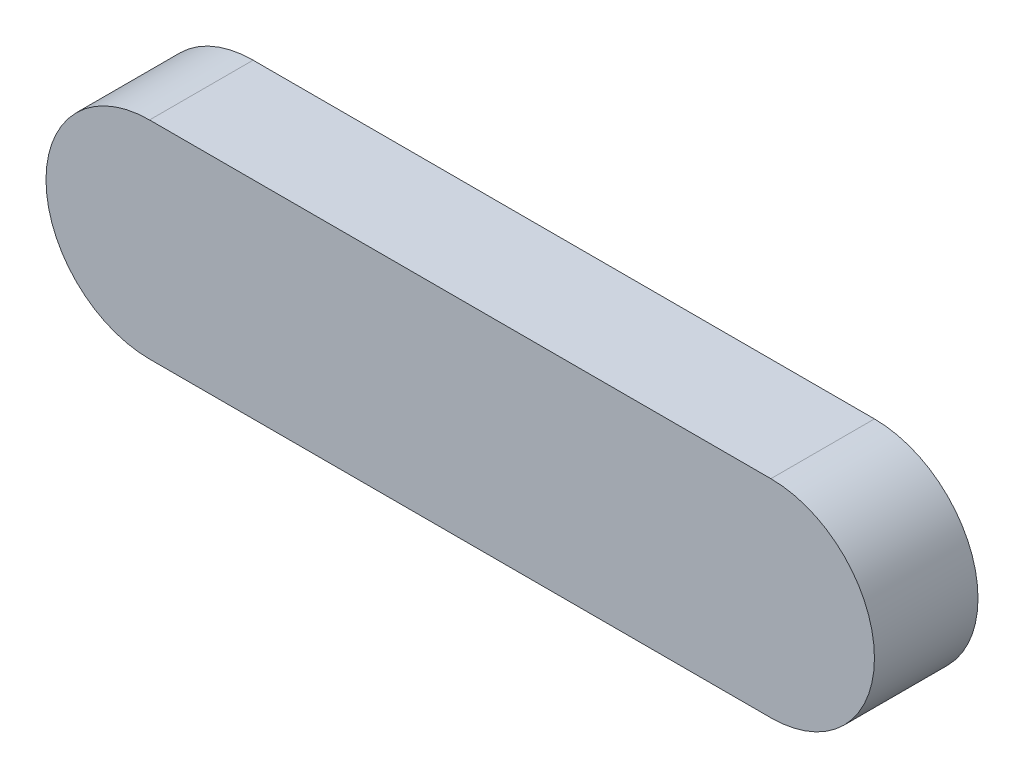
ISO-10303-21;
HEADER;
FILE_DESCRIPTION(('STEP AP214'),'2;1');
FILE_NAME('part.step','',(''),(''),'','','');
FILE_SCHEMA(('AUTOMOTIVE_DESIGN { 1 0 10303 214 1 1 1 1 }'));
ENDSEC;
DATA;
#1=APPLICATION_CONTEXT('core data for automotive mechanical design processes');
#2=APPLICATION_PROTOCOL_DEFINITION('international standard','automotive_design',2000,#1);
#3=PRODUCT_CONTEXT('',#1,'mechanical');
#4=PRODUCT('Part','Part','',(#3));
#5=PRODUCT_RELATED_PRODUCT_CATEGORY('part','',(#4));
#6=PRODUCT_DEFINITION_FORMATION('','',#4);
#7=PRODUCT_DEFINITION_CONTEXT('part definition',#1,'design');
#8=PRODUCT_DEFINITION('design','',#6,#7);
#9=PRODUCT_DEFINITION_SHAPE('','',#8);
#10=(LENGTH_UNIT() NAMED_UNIT(*) SI_UNIT(.MILLI.,.METRE.));
#11=(NAMED_UNIT(*) PLANE_ANGLE_UNIT() SI_UNIT($,.RADIAN.));
#12=(NAMED_UNIT(*) SI_UNIT($,.STERADIAN.) SOLID_ANGLE_UNIT());
#13=UNCERTAINTY_MEASURE_WITH_UNIT(LENGTH_MEASURE(1.E-05),#10,'distance_accuracy_value','');
#14=(GEOMETRIC_REPRESENTATION_CONTEXT(3) GLOBAL_UNCERTAINTY_ASSIGNED_CONTEXT((#13)) GLOBAL_UNIT_ASSIGNED_CONTEXT((#10,
#11,#12)) REPRESENTATION_CONTEXT('',''));
#15=CARTESIAN_POINT('',(0.,0.,0.));
#16=DIRECTION('',(0.,0.,1.));
#17=DIRECTION('',(1.,0.,0.));
#18=AXIS2_PLACEMENT_3D('',#15,#16,#17);
#19=CARTESIAN_POINT('',(-15.,0.,2.5));
#20=DIRECTION('',(0.,0.,-1.));
#21=DIRECTION('',(-1.,0.,0.));
#22=AXIS2_PLACEMENT_3D('',#19,#20,#21);
#23=CYLINDRICAL_SURFACE('',#22,5.);
#24=CARTESIAN_POINT('',(-15.,0.,-2.5));
#25=DIRECTION('',(0.,0.,1.));
#26=DIRECTION('',(1.,0.,0.));
#27=AXIS2_PLACEMENT_3D('',#24,#25,#26);
#28=CIRCLE('',#27,5.);
#29=CARTESIAN_POINT('',(-15.,5.,-2.5));
#30=VERTEX_POINT('',#29);
#31=CARTESIAN_POINT('',(-15.,-5.,-2.5));
#32=VERTEX_POINT('',#31);
#33=EDGE_CURVE('E113',#30,#32,#28,.T.);
#34=ORIENTED_EDGE('',*,*,#33,.T.);
#35=DIRECTION('',(0.,0.,-1.));
#36=VECTOR('',#35,1.);
#37=CARTESIAN_POINT('',(-15.,-5.,2.5));
#38=LINE('',#37,#36);
#39=CARTESIAN_POINT('',(-15.,-5.,2.5));
#40=VERTEX_POINT('',#39);
#41=EDGE_CURVE('E11',#40,#32,#38,.T.);
#42=ORIENTED_EDGE('',*,*,#41,.F.);
#43=CARTESIAN_POINT('',(-15.,0.,2.5));
#44=DIRECTION('',(0.,0.,1.));
#45=DIRECTION('',(1.,0.,0.));
#46=AXIS2_PLACEMENT_3D('',#43,#44,#45);
#47=CIRCLE('',#46,5.);
#48=CARTESIAN_POINT('',(-15.,5.,2.5));
#49=VERTEX_POINT('',#48);
#50=EDGE_CURVE('E97',#49,#40,#47,.T.);
#51=ORIENTED_EDGE('',*,*,#50,.F.);
#52=DIRECTION('',(0.,0.,-1.));
#53=VECTOR('',#52,1.);
#54=CARTESIAN_POINT('',(-15.,5.,2.5));
#55=LINE('',#54,#53);
#56=EDGE_CURVE('E109',#49,#30,#55,.T.);
#57=ORIENTED_EDGE('',*,*,#56,.T.);
#58=EDGE_LOOP('',(#34,#42,#51,#57));
#59=FACE_BOUND('',#58,.T.);
#60=ADVANCED_FACE('F45',(#59),#23,.T.);
#61=CARTESIAN_POINT('',(-15.,-5.,2.5));
#62=DIRECTION('',(0.,1.,0.));
#63=DIRECTION('',(0.,0.,1.));
#64=AXIS2_PLACEMENT_3D('',#61,#62,#63);
#65=PLANE('',#64);
#66=DIRECTION('',(1.,0.,0.));
#67=VECTOR('',#66,1.);
#68=CARTESIAN_POINT('',(-15.,-5.,-2.5));
#69=LINE('',#68,#67);
#70=CARTESIAN_POINT('',(15.,-5.,-2.5));
#71=VERTEX_POINT('',#70);
#72=EDGE_CURVE('E102',#32,#71,#69,.T.);
#73=ORIENTED_EDGE('',*,*,#72,.T.);
#74=DIRECTION('',(0.,0.,-1.));
#75=VECTOR('',#74,1.);
#76=CARTESIAN_POINT('',(15.,-5.,2.5));
#77=LINE('',#76,#75);
#78=CARTESIAN_POINT('',(15.,-5.,2.5));
#79=VERTEX_POINT('',#78);
#80=EDGE_CURVE('E54',#79,#71,#77,.T.);
#81=ORIENTED_EDGE('',*,*,#80,.F.);
#82=DIRECTION('',(1.,0.,0.));
#83=VECTOR('',#82,1.);
#84=CARTESIAN_POINT('',(-15.,-5.,2.5));
#85=LINE('',#84,#83);
#86=EDGE_CURVE('E92',#40,#79,#85,.T.);
#87=ORIENTED_EDGE('',*,*,#86,.F.);
#88=ORIENTED_EDGE('',*,*,#41,.T.);
#89=EDGE_LOOP('',(#73,#81,#87,#88));
#90=FACE_BOUND('',#89,.T.);
#91=ADVANCED_FACE('F101',(#90),#65,.F.);
#92=CARTESIAN_POINT('',(15.,0.,2.5));
#93=DIRECTION('',(0.,0.,-1.));
#94=DIRECTION('',(-1.,0.,0.));
#95=AXIS2_PLACEMENT_3D('',#92,#93,#94);
#96=CYLINDRICAL_SURFACE('',#95,5.);
#97=CARTESIAN_POINT('',(15.,0.,-2.5));
#98=DIRECTION('',(0.,0.,1.));
#99=DIRECTION('',(1.,0.,0.));
#100=AXIS2_PLACEMENT_3D('',#97,#98,#99);
#101=CIRCLE('',#100,5.);
#102=CARTESIAN_POINT('',(15.,5.,-2.5));
#103=VERTEX_POINT('',#102);
#104=EDGE_CURVE('E79',#71,#103,#101,.T.);
#105=ORIENTED_EDGE('',*,*,#104,.T.);
#106=DIRECTION('',(0.,0.,-1.));
#107=VECTOR('',#106,1.);
#108=CARTESIAN_POINT('',(15.,5.,2.5));
#109=LINE('',#108,#107);
#110=CARTESIAN_POINT('',(15.,5.,2.5));
#111=VERTEX_POINT('',#110);
#112=EDGE_CURVE('E104',#111,#103,#109,.T.);
#113=ORIENTED_EDGE('',*,*,#112,.F.);
#114=CARTESIAN_POINT('',(15.,0.,2.5));
#115=DIRECTION('',(0.,0.,1.));
#116=DIRECTION('',(1.,0.,0.));
#117=AXIS2_PLACEMENT_3D('',#114,#115,#116);
#118=CIRCLE('',#117,5.);
#119=EDGE_CURVE('E95',#79,#111,#118,.T.);
#120=ORIENTED_EDGE('',*,*,#119,.F.);
#121=ORIENTED_EDGE('',*,*,#80,.T.);
#122=EDGE_LOOP('',(#105,#113,#120,#121));
#123=FACE_BOUND('',#122,.T.);
#124=ADVANCED_FACE('F105',(#123),#96,.T.);
#125=CARTESIAN_POINT('',(-15.,5.,2.5));
#126=DIRECTION('',(0.,-1.,0.));
#127=DIRECTION('',(0.,0.,-1.));
#128=AXIS2_PLACEMENT_3D('',#125,#126,#127);
#129=PLANE('',#128);
#130=DIRECTION('',(-1.,0.,0.));
#131=VECTOR('',#130,1.);
#132=CARTESIAN_POINT('',(-15.,5.,-2.5));
#133=LINE('',#132,#131);
#134=EDGE_CURVE('E85',#103,#30,#133,.T.);
#135=ORIENTED_EDGE('',*,*,#134,.T.);
#136=ORIENTED_EDGE('',*,*,#56,.F.);
#137=DIRECTION('',(-1.,0.,0.));
#138=VECTOR('',#137,1.);
#139=CARTESIAN_POINT('',(-15.,5.,2.5));
#140=LINE('',#139,#138);
#141=EDGE_CURVE('E62',#111,#49,#140,.T.);
#142=ORIENTED_EDGE('',*,*,#141,.F.);
#143=ORIENTED_EDGE('',*,*,#112,.T.);
#144=EDGE_LOOP('',(#135,#136,#142,#143));
#145=FACE_BOUND('',#144,.T.);
#146=ADVANCED_FACE('F126',(#145),#129,.F.);
#147=CARTESIAN_POINT('',(-15.,0.,2.5));
#148=DIRECTION('',(0.,0.,1.));
#149=DIRECTION('',(1.,0.,0.));
#150=AXIS2_PLACEMENT_3D('',#147,#148,#149);
#151=PLANE('',#150);
#152=ORIENTED_EDGE('',*,*,#50,.T.);
#153=ORIENTED_EDGE('',*,*,#86,.T.);
#154=ORIENTED_EDGE('',*,*,#119,.T.);
#155=ORIENTED_EDGE('',*,*,#141,.T.);
#156=EDGE_LOOP('',(#152,#153,#154,#155));
#157=FACE_BOUND('',#156,.T.);
#158=ADVANCED_FACE('F93',(#157),#151,.T.);
#159=CARTESIAN_POINT('',(-15.,0.,-2.5));
#160=DIRECTION('',(0.,0.,1.));
#161=DIRECTION('',(1.,0.,0.));
#162=AXIS2_PLACEMENT_3D('',#159,#160,#161);
#163=PLANE('',#162);
#164=ORIENTED_EDGE('',*,*,#33,.F.);
#165=ORIENTED_EDGE('',*,*,#134,.F.);
#166=ORIENTED_EDGE('',*,*,#104,.F.);
#167=ORIENTED_EDGE('',*,*,#72,.F.);
#168=EDGE_LOOP('',(#164,#165,#166,#167));
#169=FACE_BOUND('',#168,.T.);
#170=ADVANCED_FACE('F129',(#169),#163,.F.);
#171=CLOSED_SHELL('',(#60,#91,#124,#146,#158,#170));
#172=MANIFOLD_SOLID_BREP('B2',#171);
#173=ADVANCED_BREP_SHAPE_REPRESENTATION('',(#18,#172),#14);
#174=SHAPE_DEFINITION_REPRESENTATION(#9,#173);
ENDSEC;
END-ISO-10303-21;
